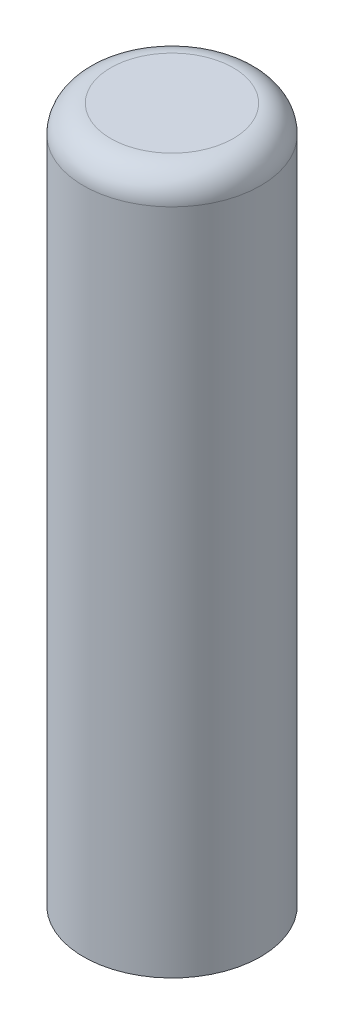
ISO-10303-21;
HEADER;
FILE_DESCRIPTION(('STEP AP214'),'2;1');
FILE_NAME('part.step','',(''),(''),'','','');
FILE_SCHEMA(('AUTOMOTIVE_DESIGN { 1 0 10303 214 1 1 1 1 }'));
ENDSEC;
DATA;
#1=APPLICATION_CONTEXT('core data for automotive mechanical design processes');
#2=APPLICATION_PROTOCOL_DEFINITION('international standard','automotive_design',2000,#1);
#3=PRODUCT_CONTEXT('',#1,'mechanical');
#4=PRODUCT('Part','Part','',(#3));
#5=PRODUCT_RELATED_PRODUCT_CATEGORY('part','',(#4));
#6=PRODUCT_DEFINITION_FORMATION('','',#4);
#7=PRODUCT_DEFINITION_CONTEXT('part definition',#1,'design');
#8=PRODUCT_DEFINITION('design','',#6,#7);
#9=PRODUCT_DEFINITION_SHAPE('','',#8);
#10=(LENGTH_UNIT() NAMED_UNIT(*) SI_UNIT(.MILLI.,.METRE.));
#11=(NAMED_UNIT(*) PLANE_ANGLE_UNIT() SI_UNIT($,.RADIAN.));
#12=(NAMED_UNIT(*) SI_UNIT($,.STERADIAN.) SOLID_ANGLE_UNIT());
#13=UNCERTAINTY_MEASURE_WITH_UNIT(LENGTH_MEASURE(1.E-05),#10,'distance_accuracy_value','');
#14=(GEOMETRIC_REPRESENTATION_CONTEXT(3) GLOBAL_UNCERTAINTY_ASSIGNED_CONTEXT((#13)) GLOBAL_UNIT_ASSIGNED_CONTEXT((#10,
#11,#12)) REPRESENTATION_CONTEXT('',''));
#15=CARTESIAN_POINT('',(0.,0.,0.));
#16=DIRECTION('',(0.,0.,1.));
#17=DIRECTION('',(1.,0.,0.));
#18=AXIS2_PLACEMENT_3D('',#15,#16,#17);
#19=CARTESIAN_POINT('',(0.,0.0999999999999995,0.));
#20=DIRECTION('',(0.,1.,0.));
#21=DIRECTION('',(-1.,0.,0.));
#22=AXIS2_PLACEMENT_3D('',#19,#20,#21);
#23=PLANE('',#22);
#24=CARTESIAN_POINT('',(0.,0.0999999999999977,0.));
#25=DIRECTION('',(0.,1.,0.));
#26=DIRECTION('',(-1.,0.,0.));
#27=AXIS2_PLACEMENT_3D('',#24,#25,#26);
#28=CIRCLE('',#27,10.1);
#29=CARTESIAN_POINT('',(-10.1,0.0999999999999965,0.));
#30=VERTEX_POINT('',#29);
#31=EDGE_CURVE('E60',#30,#30,#28,.T.);
#32=ORIENTED_EDGE('',*,*,#31,.F.);
#33=EDGE_LOOP('',(#32));
#34=FACE_BOUND('',#33,.T.);
#35=ADVANCED_FACE('F40',(#34),#23,.F.);
#36=CARTESIAN_POINT('',(0.,3.,0.));
#37=DIRECTION('',(0.,-1.,0.));
#38=DIRECTION('',(1.,0.,0.));
#39=AXIS2_PLACEMENT_3D('',#36,#37,#38);
#40=PLANE('',#39);
#41=CARTESIAN_POINT('',(0.,3.,0.));
#42=DIRECTION('',(0.,-1.,0.));
#43=DIRECTION('',(1.,0.,0.));
#44=AXIS2_PLACEMENT_3D('',#41,#42,#43);
#45=CIRCLE('',#44,8.99999999999999);
#46=CARTESIAN_POINT('',(9.,3.,0.));
#47=VERTEX_POINT('',#46);
#48=EDGE_CURVE('E47',#47,#47,#45,.F.);
#49=ORIENTED_EDGE('',*,*,#48,.T.);
#50=EDGE_LOOP('',(#49));
#51=FACE_BOUND('',#50,.T.);
#52=ADVANCED_FACE('F67',(#51),#40,.F.);
#53=CARTESIAN_POINT('',(0.,-10.,0.));
#54=DIRECTION('',(0.,1.,0.));
#55=DIRECTION('',(-1.,0.,0.));
#56=AXIS2_PLACEMENT_3D('',#53,#54,#55);
#57=CYLINDRICAL_SURFACE('',#56,13.);
#58=CARTESIAN_POINT('',(0.,-1.,0.));
#59=DIRECTION('',(0.,-1.,0.));
#60=DIRECTION('',(1.,0.,0.));
#61=AXIS2_PLACEMENT_3D('',#58,#59,#60);
#62=CIRCLE('',#61,13.);
#63=CARTESIAN_POINT('',(13.,-0.999999999999999,0.));
#64=VERTEX_POINT('',#63);
#65=EDGE_CURVE('E11',#64,#64,#62,.T.);
#66=ORIENTED_EDGE('',*,*,#65,.T.);
#67=EDGE_LOOP('',(#66));
#68=FACE_BOUND('',#67,.T.);
#69=CARTESIAN_POINT('',(0.,-99.,0.));
#70=DIRECTION('',(0.,1.,0.));
#71=DIRECTION('',(-1.,0.,0.));
#72=AXIS2_PLACEMENT_3D('',#69,#70,#71);
#73=CIRCLE('',#72,13.);
#74=CARTESIAN_POINT('',(-13.,-99.,0.));
#75=VERTEX_POINT('',#74);
#76=EDGE_CURVE('E51',#75,#75,#73,.T.);
#77=ORIENTED_EDGE('',*,*,#76,.T.);
#78=EDGE_LOOP('',(#77));
#79=FACE_BOUND('',#78,.T.);
#80=ADVANCED_FACE('F71',(#68,#79),#57,.T.);
#81=CARTESIAN_POINT('',(10.1,-99.,0.));
#82=DIRECTION('',(0.,1.,0.));
#83=DIRECTION('',(-1.,0.,0.));
#84=AXIS2_PLACEMENT_3D('',#81,#82,#83);
#85=PLANE('',#84);
#86=ORIENTED_EDGE('',*,*,#76,.F.);
#87=EDGE_LOOP('',(#86));
#88=FACE_BOUND('',#87,.T.);
#89=CARTESIAN_POINT('',(0.,-99.,0.));
#90=DIRECTION('',(0.,1.,0.));
#91=DIRECTION('',(-1.,0.,0.));
#92=AXIS2_PLACEMENT_3D('',#89,#90,#91);
#93=CIRCLE('',#92,10.1);
#94=CARTESIAN_POINT('',(-10.1,-99.,0.));
#95=VERTEX_POINT('',#94);
#96=EDGE_CURVE('E55',#95,#95,#93,.T.);
#97=ORIENTED_EDGE('',*,*,#96,.T.);
#98=EDGE_LOOP('',(#97));
#99=FACE_BOUND('',#98,.T.);
#100=ADVANCED_FACE('F76',(#88,#99),#85,.F.);
#101=CARTESIAN_POINT('',(0.,-10.,0.));
#102=DIRECTION('',(0.,1.,0.));
#103=DIRECTION('',(-1.,0.,0.));
#104=AXIS2_PLACEMENT_3D('',#101,#102,#103);
#105=CYLINDRICAL_SURFACE('',#104,10.1);
#106=ORIENTED_EDGE('',*,*,#96,.F.);
#107=EDGE_LOOP('',(#106));
#108=FACE_BOUND('',#107,.T.);
#109=ORIENTED_EDGE('',*,*,#31,.T.);
#110=EDGE_LOOP('',(#109));
#111=FACE_BOUND('',#110,.T.);
#112=ADVANCED_FACE('F64',(#108,#111),#105,.F.);
#113=CARTESIAN_POINT('',(0.,-1.,0.));
#114=DIRECTION('',(0.,-1.,0.));
#115=DIRECTION('',(1.,0.,0.));
#116=AXIS2_PLACEMENT_3D('',#113,#114,#115);
#117=TOROIDAL_SURFACE('',#116,8.99999999999999,4.);
#118=ORIENTED_EDGE('',*,*,#65,.F.);
#119=EDGE_LOOP('',(#118));
#120=FACE_BOUND('',#119,.T.);
#121=ORIENTED_EDGE('',*,*,#48,.F.);
#122=EDGE_LOOP('',(#121));
#123=FACE_BOUND('',#122,.T.);
#124=ADVANCED_FACE('F42',(#120,#123),#117,.T.);
#125=CLOSED_SHELL('',(#35,#52,#80,#100,#112,#124));
#126=MANIFOLD_SOLID_BREP('B2',#125);
#127=CARTESIAN_POINT('',(0.,0.,0.));
#128=DIRECTION('',(0.,-1.,0.));
#129=DIRECTION('',(1.,0.,0.));
#130=AXIS2_PLACEMENT_3D('',#127,#128,#129);
#131=PLANE('',#130);
#132=CARTESIAN_POINT('',(0.,0.,0.));
#133=DIRECTION('',(0.,1.,0.));
#134=DIRECTION('',(-1.,0.,0.));
#135=AXIS2_PLACEMENT_3D('',#132,#133,#134);
#136=CIRCLE('',#135,9.99999999999999);
#137=CARTESIAN_POINT('',(-9.99999999999998,0.,0.));
#138=VERTEX_POINT('',#137);
#139=EDGE_CURVE('E39',#138,#138,#136,.T.);
#140=ORIENTED_EDGE('',*,*,#139,.T.);
#141=EDGE_LOOP('',(#140));
#142=FACE_BOUND('',#141,.T.);
#143=ADVANCED_FACE('F125',(#142),#131,.F.);
#144=CARTESIAN_POINT('',(0.,-10.,0.));
#145=DIRECTION('',(0.,1.,0.));
#146=DIRECTION('',(-1.,0.,0.));
#147=AXIS2_PLACEMENT_3D('',#144,#145,#146);
#148=CYLINDRICAL_SURFACE('',#147,9.99999999999999);
#149=ORIENTED_EDGE('',*,*,#139,.F.);
#150=EDGE_LOOP('',(#149));
#151=FACE_BOUND('',#150,.T.);
#152=CARTESIAN_POINT('',(0.,-99.,0.));
#153=DIRECTION('',(0.,1.,0.));
#154=DIRECTION('',(-1.,0.,0.));
#155=AXIS2_PLACEMENT_3D('',#152,#153,#154);
#156=CIRCLE('',#155,9.99999999999999);
#157=CARTESIAN_POINT('',(-9.99999999999997,-99.,0.));
#158=VERTEX_POINT('',#157);
#159=EDGE_CURVE('E131',#158,#158,#156,.T.);
#160=ORIENTED_EDGE('',*,*,#159,.T.);
#161=EDGE_LOOP('',(#160));
#162=FACE_BOUND('',#161,.T.);
#163=ADVANCED_FACE('F163',(#151,#162),#148,.T.);
#164=CARTESIAN_POINT('',(10.,-99.,0.));
#165=DIRECTION('',(0.,1.,0.));
#166=DIRECTION('',(-1.,0.,0.));
#167=AXIS2_PLACEMENT_3D('',#164,#165,#166);
#168=PLANE('',#167);
#169=ORIENTED_EDGE('',*,*,#159,.F.);
#170=EDGE_LOOP('',(#169));
#171=FACE_BOUND('',#170,.T.);
#172=CARTESIAN_POINT('',(0.,-99.,0.));
#173=DIRECTION('',(0.,1.,0.));
#174=DIRECTION('',(-1.,0.,0.));
#175=AXIS2_PLACEMENT_3D('',#172,#173,#174);
#176=CIRCLE('',#175,8.99999999999999);
#177=CARTESIAN_POINT('',(-8.99999999999997,-99.,0.));
#178=VERTEX_POINT('',#177);
#179=EDGE_CURVE('E135',#178,#178,#176,.T.);
#180=ORIENTED_EDGE('',*,*,#179,.T.);
#181=EDGE_LOOP('',(#180));
#182=FACE_BOUND('',#181,.T.);
#183=ADVANCED_FACE('F167',(#171,#182),#168,.F.);
#184=CARTESIAN_POINT('',(0.,-10.,0.));
#185=DIRECTION('',(0.,1.,0.));
#186=DIRECTION('',(-1.,0.,0.));
#187=AXIS2_PLACEMENT_3D('',#184,#185,#186);
#188=CYLINDRICAL_SURFACE('',#187,8.99999999999999);
#189=ORIENTED_EDGE('',*,*,#179,.F.);
#190=EDGE_LOOP('',(#189));
#191=FACE_BOUND('',#190,.T.);
#192=CARTESIAN_POINT('',(0.,-100.,0.));
#193=DIRECTION('',(0.,1.,0.));
#194=DIRECTION('',(-1.,0.,0.));
#195=AXIS2_PLACEMENT_3D('',#192,#193,#194);
#196=CIRCLE('',#195,9.);
#197=CARTESIAN_POINT('',(-8.99999999999998,-100.,0.));
#198=VERTEX_POINT('',#197);
#199=EDGE_CURVE('E139',#198,#198,#196,.T.);
#200=ORIENTED_EDGE('',*,*,#199,.T.);
#201=EDGE_LOOP('',(#200));
#202=FACE_BOUND('',#201,.T.);
#203=ADVANCED_FACE('F172',(#191,#202),#188,.T.);
#204=CARTESIAN_POINT('',(9.00000000000002,-100.,0.));
#205=DIRECTION('',(0.,1.,0.));
#206=DIRECTION('',(-1.,0.,0.));
#207=AXIS2_PLACEMENT_3D('',#204,#205,#206);
#208=PLANE('',#207);
#209=ORIENTED_EDGE('',*,*,#199,.F.);
#210=EDGE_LOOP('',(#209));
#211=FACE_BOUND('',#210,.T.);
#212=CARTESIAN_POINT('',(0.,-100.,0.));
#213=DIRECTION('',(0.,1.,0.));
#214=DIRECTION('',(-1.,0.,0.));
#215=AXIS2_PLACEMENT_3D('',#212,#213,#214);
#216=CIRCLE('',#215,2.99999999999999);
#217=CARTESIAN_POINT('',(-2.99999999999997,-100.,0.));
#218=VERTEX_POINT('',#217);
#219=EDGE_CURVE('E144',#218,#218,#216,.T.);
#220=ORIENTED_EDGE('',*,*,#219,.T.);
#221=EDGE_LOOP('',(#220));
#222=FACE_BOUND('',#221,.T.);
#223=ADVANCED_FACE('F159',(#211,#222),#208,.F.);
#224=CARTESIAN_POINT('',(0.,-10.,0.));
#225=DIRECTION('',(0.,1.,0.));
#226=DIRECTION('',(-1.,0.,0.));
#227=AXIS2_PLACEMENT_3D('',#224,#225,#226);
#228=CYLINDRICAL_SURFACE('',#227,3.);
#229=ORIENTED_EDGE('',*,*,#219,.F.);
#230=EDGE_LOOP('',(#229));
#231=FACE_BOUND('',#230,.T.);
#232=CARTESIAN_POINT('',(0.,-10.,0.));
#233=DIRECTION('',(0.,1.,0.));
#234=DIRECTION('',(-1.,0.,0.));
#235=AXIS2_PLACEMENT_3D('',#232,#233,#234);
#236=CIRCLE('',#235,3.);
#237=CARTESIAN_POINT('',(-2.99999999999999,-10.,0.));
#238=VERTEX_POINT('',#237);
#239=EDGE_CURVE('E147',#238,#238,#236,.T.);
#240=ORIENTED_EDGE('',*,*,#239,.T.);
#241=EDGE_LOOP('',(#240));
#242=FACE_BOUND('',#241,.T.);
#243=ADVANCED_FACE('F151',(#231,#242),#228,.F.);
#244=CARTESIAN_POINT('',(3.00000000000001,-10.,0.));
#245=DIRECTION('',(0.,1.,0.));
#246=DIRECTION('',(-1.,0.,0.));
#247=AXIS2_PLACEMENT_3D('',#244,#245,#246);
#248=PLANE('',#247);
#249=ORIENTED_EDGE('',*,*,#239,.F.);
#250=EDGE_LOOP('',(#249));
#251=FACE_BOUND('',#250,.T.);
#252=ADVANCED_FACE('F153',(#251),#248,.F.);
#253=CLOSED_SHELL('',(#143,#163,#183,#203,#223,#243,#252));
#254=MANIFOLD_SOLID_BREP('B6',#253);
#255=ADVANCED_BREP_SHAPE_REPRESENTATION('',(#18,#126,#254),#14);
#256=SHAPE_DEFINITION_REPRESENTATION(#9,#255);
ENDSEC;
END-ISO-10303-21;
